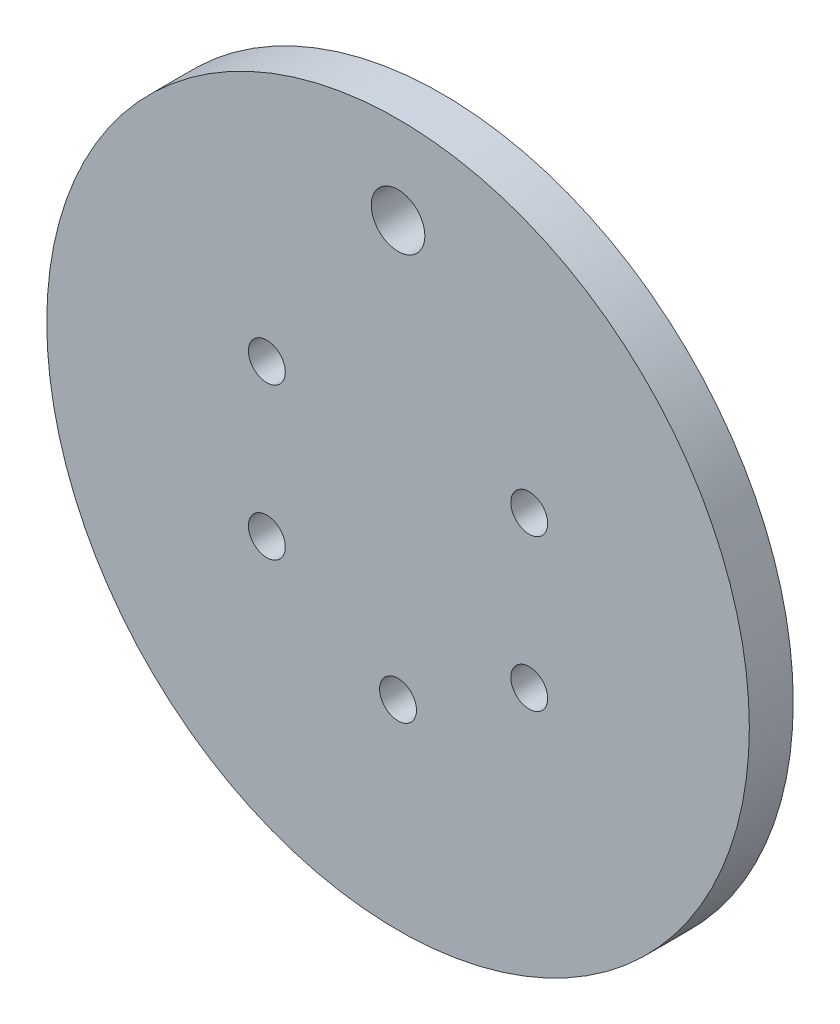
ISO-10303-21;
HEADER;
FILE_DESCRIPTION(('STEP AP214'),'2;1');
FILE_NAME('part.step','',(''),(''),'','','');
FILE_SCHEMA(('AUTOMOTIVE_DESIGN { 1 0 10303 214 1 1 1 1 }'));
ENDSEC;
DATA;
#1=APPLICATION_CONTEXT('core data for automotive mechanical design processes');
#2=APPLICATION_PROTOCOL_DEFINITION('international standard','automotive_design',2000,#1);
#3=PRODUCT_CONTEXT('',#1,'mechanical');
#4=PRODUCT('Part','Part','',(#3));
#5=PRODUCT_RELATED_PRODUCT_CATEGORY('part','',(#4));
#6=PRODUCT_DEFINITION_FORMATION('','',#4);
#7=PRODUCT_DEFINITION_CONTEXT('part definition',#1,'design');
#8=PRODUCT_DEFINITION('design','',#6,#7);
#9=PRODUCT_DEFINITION_SHAPE('','',#8);
#10=(LENGTH_UNIT() NAMED_UNIT(*) SI_UNIT(.MILLI.,.METRE.));
#11=(NAMED_UNIT(*) PLANE_ANGLE_UNIT() SI_UNIT($,.RADIAN.));
#12=(NAMED_UNIT(*) SI_UNIT($,.STERADIAN.) SOLID_ANGLE_UNIT());
#13=UNCERTAINTY_MEASURE_WITH_UNIT(LENGTH_MEASURE(1.E-05),#10,'distance_accuracy_value','');
#14=(GEOMETRIC_REPRESENTATION_CONTEXT(3) GLOBAL_UNCERTAINTY_ASSIGNED_CONTEXT((#13)) GLOBAL_UNIT_ASSIGNED_CONTEXT((#10,
#11,#12)) REPRESENTATION_CONTEXT('',''));
#15=CARTESIAN_POINT('',(0.,0.,0.));
#16=DIRECTION('',(0.,0.,1.));
#17=DIRECTION('',(1.,0.,0.));
#18=AXIS2_PLACEMENT_3D('',#15,#16,#17);
#19=CARTESIAN_POINT('',(0.,0.,5.));
#20=DIRECTION('',(0.,0.,1.));
#21=DIRECTION('',(1.,0.,0.));
#22=AXIS2_PLACEMENT_3D('',#19,#20,#21);
#23=PLANE('',#22);
#24=CARTESIAN_POINT('',(0.,30.,5.));
#25=DIRECTION('',(0.,0.,1.));
#26=DIRECTION('',(1.,0.,0.));
#27=AXIS2_PLACEMENT_3D('',#24,#25,#26);
#28=CIRCLE('',#27,3.05);
#29=CARTESIAN_POINT('',(3.05,30.,5.));
#30=VERTEX_POINT('',#29);
#31=EDGE_CURVE('E127',#30,#30,#28,.T.);
#32=ORIENTED_EDGE('',*,*,#31,.F.);
#33=EDGE_LOOP('',(#32));
#34=FACE_BOUND('',#33,.T.);
#35=CARTESIAN_POINT('',(0.,-17.25,5.));
#36=DIRECTION('',(0.,0.,1.));
#37=DIRECTION('',(1.,0.,0.));
#38=AXIS2_PLACEMENT_3D('',#35,#36,#37);
#39=CIRCLE('',#38,2.1);
#40=CARTESIAN_POINT('',(2.1,-17.25,5.));
#41=VERTEX_POINT('',#40);
#42=EDGE_CURVE('E108',#41,#41,#39,.T.);
#43=ORIENTED_EDGE('',*,*,#42,.F.);
#44=EDGE_LOOP('',(#43));
#45=FACE_BOUND('',#44,.T.);
#46=CARTESIAN_POINT('',(14.9389382152816,8.62500000000001,5.));
#47=DIRECTION('',(0.,0.,1.));
#48=DIRECTION('',(1.,0.,0.));
#49=AXIS2_PLACEMENT_3D('',#46,#47,#48);
#50=CIRCLE('',#49,2.1);
#51=CARTESIAN_POINT('',(17.0389382152816,8.62500000000001,5.));
#52=VERTEX_POINT('',#51);
#53=EDGE_CURVE('E92',#52,#52,#50,.T.);
#54=ORIENTED_EDGE('',*,*,#53,.F.);
#55=EDGE_LOOP('',(#54));
#56=FACE_BOUND('',#55,.T.);
#57=CARTESIAN_POINT('',(0.,0.,5.));
#58=DIRECTION('',(0.,0.,1.));
#59=DIRECTION('',(1.,0.,0.));
#60=AXIS2_PLACEMENT_3D('',#57,#58,#59);
#61=CIRCLE('',#60,40.);
#62=CARTESIAN_POINT('',(40.,0.,5.));
#63=VERTEX_POINT('',#62);
#64=EDGE_CURVE('E11',#63,#63,#61,.T.);
#65=ORIENTED_EDGE('',*,*,#64,.T.);
#66=EDGE_LOOP('',(#65));
#67=FACE_BOUND('',#66,.T.);
#68=CARTESIAN_POINT('',(-14.9389382152816,8.62499999999999,5.));
#69=DIRECTION('',(0.,0.,1.));
#70=DIRECTION('',(1.,0.,0.));
#71=AXIS2_PLACEMENT_3D('',#68,#69,#70);
#72=CIRCLE('',#71,2.1);
#73=CARTESIAN_POINT('',(-12.8389382152816,8.62499999999999,5.));
#74=VERTEX_POINT('',#73);
#75=EDGE_CURVE('E86',#74,#74,#72,.T.);
#76=ORIENTED_EDGE('',*,*,#75,.F.);
#77=EDGE_LOOP('',(#76));
#78=FACE_BOUND('',#77,.T.);
#79=CARTESIAN_POINT('',(14.9389382152816,-8.625,5.));
#80=DIRECTION('',(0.,0.,1.));
#81=DIRECTION('',(1.,0.,0.));
#82=AXIS2_PLACEMENT_3D('',#79,#80,#81);
#83=CIRCLE('',#82,2.1);
#84=CARTESIAN_POINT('',(17.0389382152816,-8.625,5.));
#85=VERTEX_POINT('',#84);
#86=EDGE_CURVE('E100',#85,#85,#83,.T.);
#87=ORIENTED_EDGE('',*,*,#86,.F.);
#88=EDGE_LOOP('',(#87));
#89=FACE_BOUND('',#88,.T.);
#90=CARTESIAN_POINT('',(-14.9389382152816,-8.62500000000001,5.));
#91=DIRECTION('',(0.,0.,1.));
#92=DIRECTION('',(1.,0.,0.));
#93=AXIS2_PLACEMENT_3D('',#90,#91,#92);
#94=CIRCLE('',#93,2.1);
#95=CARTESIAN_POINT('',(-12.8389382152816,-8.62500000000001,5.));
#96=VERTEX_POINT('',#95);
#97=EDGE_CURVE('E116',#96,#96,#94,.T.);
#98=ORIENTED_EDGE('',*,*,#97,.F.);
#99=EDGE_LOOP('',(#98));
#100=FACE_BOUND('',#99,.T.);
#101=ADVANCED_FACE('F71',(#34,#45,#56,#67,#78,#89,#100),#23,.T.);
#102=CARTESIAN_POINT('',(0.,0.,0.));
#103=DIRECTION('',(0.,0.,1.));
#104=DIRECTION('',(1.,0.,0.));
#105=AXIS2_PLACEMENT_3D('',#102,#103,#104);
#106=PLANE('',#105);
#107=CARTESIAN_POINT('',(0.,30.,0.));
#108=DIRECTION('',(0.,0.,1.));
#109=DIRECTION('',(1.,0.,0.));
#110=AXIS2_PLACEMENT_3D('',#107,#108,#109);
#111=CIRCLE('',#110,3.05);
#112=CARTESIAN_POINT('',(3.05,30.,0.));
#113=VERTEX_POINT('',#112);
#114=EDGE_CURVE('E75',#113,#113,#111,.T.);
#115=ORIENTED_EDGE('',*,*,#114,.T.);
#116=EDGE_LOOP('',(#115));
#117=FACE_BOUND('',#116,.T.);
#118=CARTESIAN_POINT('',(0.,0.,0.));
#119=DIRECTION('',(0.,0.,1.));
#120=DIRECTION('',(1.,0.,0.));
#121=AXIS2_PLACEMENT_3D('',#118,#119,#120);
#122=CIRCLE('',#121,40.);
#123=CARTESIAN_POINT('',(40.,0.,0.));
#124=VERTEX_POINT('',#123);
#125=EDGE_CURVE('E80',#124,#124,#122,.T.);
#126=ORIENTED_EDGE('',*,*,#125,.F.);
#127=EDGE_LOOP('',(#126));
#128=FACE_BOUND('',#127,.T.);
#129=CARTESIAN_POINT('',(-14.9389382152816,8.62499999999999,0.));
#130=DIRECTION('',(0.,0.,1.));
#131=DIRECTION('',(1.,0.,0.));
#132=AXIS2_PLACEMENT_3D('',#129,#130,#131);
#133=CIRCLE('',#132,2.1);
#134=CARTESIAN_POINT('',(-12.8389382152816,8.62499999999999,0.));
#135=VERTEX_POINT('',#134);
#136=EDGE_CURVE('E88',#135,#135,#133,.T.);
#137=ORIENTED_EDGE('',*,*,#136,.T.);
#138=EDGE_LOOP('',(#137));
#139=FACE_BOUND('',#138,.T.);
#140=CARTESIAN_POINT('',(14.9389382152816,8.62500000000001,0.));
#141=DIRECTION('',(0.,0.,1.));
#142=DIRECTION('',(1.,0.,0.));
#143=AXIS2_PLACEMENT_3D('',#140,#141,#142);
#144=CIRCLE('',#143,2.1);
#145=CARTESIAN_POINT('',(17.0389382152816,8.62500000000001,0.));
#146=VERTEX_POINT('',#145);
#147=EDGE_CURVE('E96',#146,#146,#144,.T.);
#148=ORIENTED_EDGE('',*,*,#147,.T.);
#149=EDGE_LOOP('',(#148));
#150=FACE_BOUND('',#149,.T.);
#151=CARTESIAN_POINT('',(14.9389382152816,-8.625,0.));
#152=DIRECTION('',(0.,0.,1.));
#153=DIRECTION('',(1.,0.,0.));
#154=AXIS2_PLACEMENT_3D('',#151,#152,#153);
#155=CIRCLE('',#154,2.1);
#156=CARTESIAN_POINT('',(17.0389382152816,-8.625,0.));
#157=VERTEX_POINT('',#156);
#158=EDGE_CURVE('E104',#157,#157,#155,.T.);
#159=ORIENTED_EDGE('',*,*,#158,.T.);
#160=EDGE_LOOP('',(#159));
#161=FACE_BOUND('',#160,.T.);
#162=CARTESIAN_POINT('',(0.,-17.25,0.));
#163=DIRECTION('',(0.,0.,1.));
#164=DIRECTION('',(1.,0.,0.));
#165=AXIS2_PLACEMENT_3D('',#162,#163,#164);
#166=CIRCLE('',#165,2.1);
#167=CARTESIAN_POINT('',(2.1,-17.25,0.));
#168=VERTEX_POINT('',#167);
#169=EDGE_CURVE('E112',#168,#168,#166,.T.);
#170=ORIENTED_EDGE('',*,*,#169,.T.);
#171=EDGE_LOOP('',(#170));
#172=FACE_BOUND('',#171,.T.);
#173=CARTESIAN_POINT('',(-14.9389382152816,-8.62500000000001,0.));
#174=DIRECTION('',(0.,0.,1.));
#175=DIRECTION('',(1.,0.,0.));
#176=AXIS2_PLACEMENT_3D('',#173,#174,#175);
#177=CIRCLE('',#176,2.1);
#178=CARTESIAN_POINT('',(-12.8389382152816,-8.62500000000001,0.));
#179=VERTEX_POINT('',#178);
#180=EDGE_CURVE('E120',#179,#179,#177,.T.);
#181=ORIENTED_EDGE('',*,*,#180,.T.);
#182=EDGE_LOOP('',(#181));
#183=FACE_BOUND('',#182,.T.);
#184=ADVANCED_FACE('F136',(#117,#128,#139,#150,#161,#172,#183),#106,.F.);
#185=CARTESIAN_POINT('',(0.,0.,5.));
#186=DIRECTION('',(0.,0.,-1.));
#187=DIRECTION('',(-1.,0.,0.));
#188=AXIS2_PLACEMENT_3D('',#185,#186,#187);
#189=CYLINDRICAL_SURFACE('',#188,40.);
#190=ORIENTED_EDGE('',*,*,#64,.F.);
#191=EDGE_LOOP('',(#190));
#192=FACE_BOUND('',#191,.T.);
#193=ORIENTED_EDGE('',*,*,#125,.T.);
#194=EDGE_LOOP('',(#193));
#195=FACE_BOUND('',#194,.T.);
#196=ADVANCED_FACE('F73',(#192,#195),#189,.T.);
#197=CARTESIAN_POINT('',(-14.9389382152816,8.62499999999999,5.));
#198=DIRECTION('',(0.,0.,-1.));
#199=DIRECTION('',(-1.,0.,0.));
#200=AXIS2_PLACEMENT_3D('',#197,#198,#199);
#201=CYLINDRICAL_SURFACE('',#200,2.1);
#202=ORIENTED_EDGE('',*,*,#75,.T.);
#203=EDGE_LOOP('',(#202));
#204=FACE_BOUND('',#203,.T.);
#205=ORIENTED_EDGE('',*,*,#136,.F.);
#206=EDGE_LOOP('',(#205));
#207=FACE_BOUND('',#206,.T.);
#208=ADVANCED_FACE('F157',(#204,#207),#201,.F.);
#209=CARTESIAN_POINT('',(14.9389382152816,8.62500000000001,5.));
#210=DIRECTION('',(0.,0.,-1.));
#211=DIRECTION('',(-1.,0.,0.));
#212=AXIS2_PLACEMENT_3D('',#209,#210,#211);
#213=CYLINDRICAL_SURFACE('',#212,2.1);
#214=ORIENTED_EDGE('',*,*,#53,.T.);
#215=EDGE_LOOP('',(#214));
#216=FACE_BOUND('',#215,.T.);
#217=ORIENTED_EDGE('',*,*,#147,.F.);
#218=EDGE_LOOP('',(#217));
#219=FACE_BOUND('',#218,.T.);
#220=ADVANCED_FACE('F160',(#216,#219),#213,.F.);
#221=CARTESIAN_POINT('',(14.9389382152816,-8.625,5.));
#222=DIRECTION('',(0.,0.,-1.));
#223=DIRECTION('',(-1.,0.,0.));
#224=AXIS2_PLACEMENT_3D('',#221,#222,#223);
#225=CYLINDRICAL_SURFACE('',#224,2.1);
#226=ORIENTED_EDGE('',*,*,#86,.T.);
#227=EDGE_LOOP('',(#226));
#228=FACE_BOUND('',#227,.T.);
#229=ORIENTED_EDGE('',*,*,#158,.F.);
#230=EDGE_LOOP('',(#229));
#231=FACE_BOUND('',#230,.T.);
#232=ADVANCED_FACE('F164',(#228,#231),#225,.F.);
#233=CARTESIAN_POINT('',(0.,-17.25,5.));
#234=DIRECTION('',(0.,0.,-1.));
#235=DIRECTION('',(-1.,0.,0.));
#236=AXIS2_PLACEMENT_3D('',#233,#234,#235);
#237=CYLINDRICAL_SURFACE('',#236,2.1);
#238=ORIENTED_EDGE('',*,*,#42,.T.);
#239=EDGE_LOOP('',(#238));
#240=FACE_BOUND('',#239,.T.);
#241=ORIENTED_EDGE('',*,*,#169,.F.);
#242=EDGE_LOOP('',(#241));
#243=FACE_BOUND('',#242,.T.);
#244=ADVANCED_FACE('F146',(#240,#243),#237,.F.);
#245=CARTESIAN_POINT('',(-14.9389382152816,-8.62500000000001,5.));
#246=DIRECTION('',(0.,0.,-1.));
#247=DIRECTION('',(-1.,0.,0.));
#248=AXIS2_PLACEMENT_3D('',#245,#246,#247);
#249=CYLINDRICAL_SURFACE('',#248,2.1);
#250=ORIENTED_EDGE('',*,*,#97,.T.);
#251=EDGE_LOOP('',(#250));
#252=FACE_BOUND('',#251,.T.);
#253=ORIENTED_EDGE('',*,*,#180,.F.);
#254=EDGE_LOOP('',(#253));
#255=FACE_BOUND('',#254,.T.);
#256=ADVANCED_FACE('F141',(#252,#255),#249,.F.);
#257=CARTESIAN_POINT('',(0.,30.,-5.));
#258=DIRECTION('',(0.,0.,1.));
#259=DIRECTION('',(1.,0.,0.));
#260=AXIS2_PLACEMENT_3D('',#257,#258,#259);
#261=CYLINDRICAL_SURFACE('',#260,3.05);
#262=ORIENTED_EDGE('',*,*,#31,.T.);
#263=EDGE_LOOP('',(#262));
#264=FACE_BOUND('',#263,.T.);
#265=ORIENTED_EDGE('',*,*,#114,.F.);
#266=EDGE_LOOP('',(#265));
#267=FACE_BOUND('',#266,.T.);
#268=ADVANCED_FACE('F139',(#264,#267),#261,.F.);
#269=CLOSED_SHELL('',(#101,#184,#196,#208,#220,#232,#244,#256,#268));
#270=MANIFOLD_SOLID_BREP('B2',#269);
#271=ADVANCED_BREP_SHAPE_REPRESENTATION('',(#18,#270),#14);
#272=SHAPE_DEFINITION_REPRESENTATION(#9,#271);
ENDSEC;
END-ISO-10303-21;
